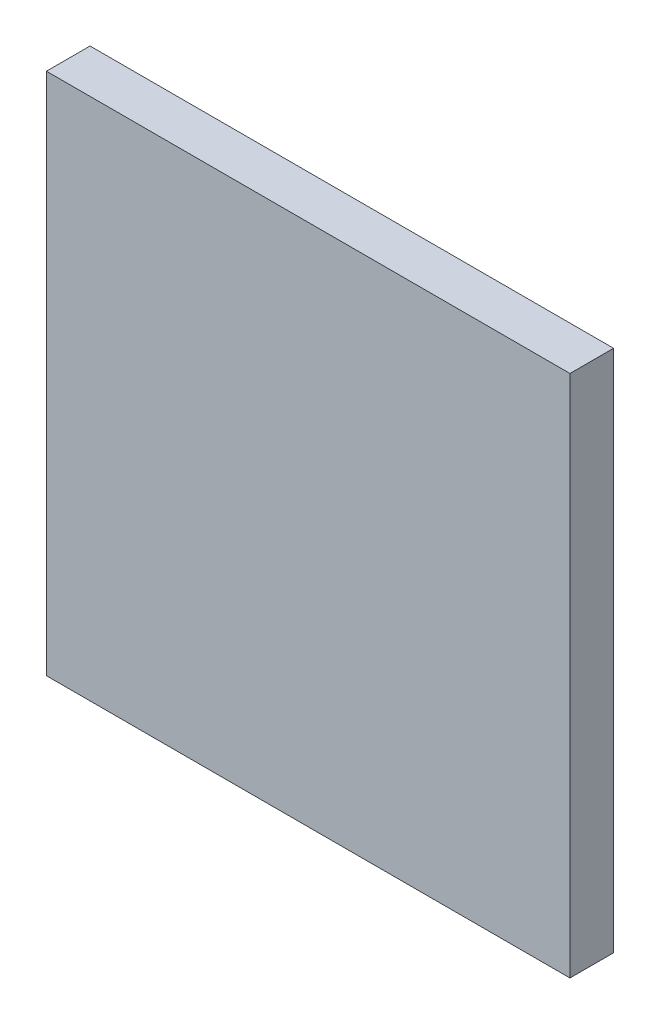
ISO-10303-21;
HEADER;
FILE_DESCRIPTION(('STEP AP214'),'2;1');
FILE_NAME('part.step','',(''),(''),'','','');
FILE_SCHEMA(('AUTOMOTIVE_DESIGN { 1 0 10303 214 1 1 1 1 }'));
ENDSEC;
DATA;
#1=APPLICATION_CONTEXT('core data for automotive mechanical design processes');
#2=APPLICATION_PROTOCOL_DEFINITION('international standard','automotive_design',2000,#1);
#3=PRODUCT_CONTEXT('',#1,'mechanical');
#4=PRODUCT('Part','Part','',(#3));
#5=PRODUCT_RELATED_PRODUCT_CATEGORY('part','',(#4));
#6=PRODUCT_DEFINITION_FORMATION('','',#4);
#7=PRODUCT_DEFINITION_CONTEXT('part definition',#1,'design');
#8=PRODUCT_DEFINITION('design','',#6,#7);
#9=PRODUCT_DEFINITION_SHAPE('','',#8);
#10=(LENGTH_UNIT() NAMED_UNIT(*) SI_UNIT(.MILLI.,.METRE.));
#11=(NAMED_UNIT(*) PLANE_ANGLE_UNIT() SI_UNIT($,.RADIAN.));
#12=(NAMED_UNIT(*) SI_UNIT($,.STERADIAN.) SOLID_ANGLE_UNIT());
#13=UNCERTAINTY_MEASURE_WITH_UNIT(LENGTH_MEASURE(1.E-05),#10,'distance_accuracy_value','');
#14=(GEOMETRIC_REPRESENTATION_CONTEXT(3) GLOBAL_UNCERTAINTY_ASSIGNED_CONTEXT((#13)) GLOBAL_UNIT_ASSIGNED_CONTEXT((#10,
#11,#12)) REPRESENTATION_CONTEXT('',''));
#15=CARTESIAN_POINT('',(0.,0.,0.));
#16=DIRECTION('',(0.,0.,1.));
#17=DIRECTION('',(1.,0.,0.));
#18=AXIS2_PLACEMENT_3D('',#15,#16,#17);
#19=CARTESIAN_POINT('',(0.,0.,1.5));
#20=DIRECTION('',(1.,0.,0.));
#21=DIRECTION('',(0.,0.,-1.));
#22=AXIS2_PLACEMENT_3D('',#19,#20,#21);
#23=PLANE('',#22);
#24=DIRECTION('',(0.,-1.,0.));
#25=VECTOR('',#24,1.);
#26=CARTESIAN_POINT('',(0.,0.,0.));
#27=LINE('',#26,#25);
#28=CARTESIAN_POINT('',(0.,18.,0.));
#29=VERTEX_POINT('',#28);
#30=CARTESIAN_POINT('',(0.,0.,0.));
#31=VERTEX_POINT('',#30);
#32=EDGE_CURVE('E86',#29,#31,#27,.T.);
#33=ORIENTED_EDGE('',*,*,#32,.T.);
#34=DIRECTION('',(0.,0.,-1.));
#35=VECTOR('',#34,1.);
#36=CARTESIAN_POINT('',(0.,0.,1.5));
#37=LINE('',#36,#35);
#38=CARTESIAN_POINT('',(0.,0.,1.5));
#39=VERTEX_POINT('',#38);
#40=EDGE_CURVE('E11',#39,#31,#37,.T.);
#41=ORIENTED_EDGE('',*,*,#40,.F.);
#42=DIRECTION('',(0.,-1.,0.));
#43=VECTOR('',#42,1.);
#44=CARTESIAN_POINT('',(0.,0.,1.5));
#45=LINE('',#44,#43);
#46=CARTESIAN_POINT('',(0.,18.,1.5));
#47=VERTEX_POINT('',#46);
#48=EDGE_CURVE('E68',#47,#39,#45,.T.);
#49=ORIENTED_EDGE('',*,*,#48,.F.);
#50=DIRECTION('',(0.,0.,-1.));
#51=VECTOR('',#50,1.);
#52=CARTESIAN_POINT('',(0.,18.,1.5));
#53=LINE('',#52,#51);
#54=EDGE_CURVE('E82',#47,#29,#53,.T.);
#55=ORIENTED_EDGE('',*,*,#54,.T.);
#56=EDGE_LOOP('',(#33,#41,#49,#55));
#57=FACE_BOUND('',#56,.T.);
#58=ADVANCED_FACE('F16',(#57),#23,.F.);
#59=CARTESIAN_POINT('',(0.,0.,1.5));
#60=DIRECTION('',(0.,1.,0.));
#61=DIRECTION('',(0.,0.,1.));
#62=AXIS2_PLACEMENT_3D('',#59,#60,#61);
#63=PLANE('',#62);
#64=DIRECTION('',(1.,0.,0.));
#65=VECTOR('',#64,1.);
#66=CARTESIAN_POINT('',(0.,0.,0.));
#67=LINE('',#66,#65);
#68=CARTESIAN_POINT('',(18.,0.,0.));
#69=VERTEX_POINT('',#68);
#70=EDGE_CURVE('E73',#31,#69,#67,.T.);
#71=ORIENTED_EDGE('',*,*,#70,.T.);
#72=DIRECTION('',(0.,0.,-1.));
#73=VECTOR('',#72,1.);
#74=CARTESIAN_POINT('',(18.,0.,1.5));
#75=LINE('',#74,#73);
#76=CARTESIAN_POINT('',(18.,0.,1.5));
#77=VERTEX_POINT('',#76);
#78=EDGE_CURVE('E25',#77,#69,#75,.T.);
#79=ORIENTED_EDGE('',*,*,#78,.F.);
#80=DIRECTION('',(1.,0.,0.));
#81=VECTOR('',#80,1.);
#82=CARTESIAN_POINT('',(0.,0.,1.5));
#83=LINE('',#82,#81);
#84=EDGE_CURVE('E63',#39,#77,#83,.T.);
#85=ORIENTED_EDGE('',*,*,#84,.F.);
#86=ORIENTED_EDGE('',*,*,#40,.T.);
#87=EDGE_LOOP('',(#71,#79,#85,#86));
#88=FACE_BOUND('',#87,.T.);
#89=ADVANCED_FACE('F72',(#88),#63,.F.);
#90=CARTESIAN_POINT('',(18.,0.,1.5));
#91=DIRECTION('',(-1.,0.,0.));
#92=DIRECTION('',(0.,0.,1.));
#93=AXIS2_PLACEMENT_3D('',#90,#91,#92);
#94=PLANE('',#93);
#95=DIRECTION('',(0.,1.,0.));
#96=VECTOR('',#95,1.);
#97=CARTESIAN_POINT('',(18.,0.,0.));
#98=LINE('',#97,#96);
#99=CARTESIAN_POINT('',(18.,18.,0.));
#100=VERTEX_POINT('',#99);
#101=EDGE_CURVE('E50',#69,#100,#98,.T.);
#102=ORIENTED_EDGE('',*,*,#101,.T.);
#103=DIRECTION('',(0.,0.,-1.));
#104=VECTOR('',#103,1.);
#105=CARTESIAN_POINT('',(18.,18.,1.5));
#106=LINE('',#105,#104);
#107=CARTESIAN_POINT('',(18.,18.,1.5));
#108=VERTEX_POINT('',#107);
#109=EDGE_CURVE('E75',#108,#100,#106,.T.);
#110=ORIENTED_EDGE('',*,*,#109,.F.);
#111=DIRECTION('',(0.,1.,0.));
#112=VECTOR('',#111,1.);
#113=CARTESIAN_POINT('',(18.,0.,1.5));
#114=LINE('',#113,#112);
#115=EDGE_CURVE('E66',#77,#108,#114,.T.);
#116=ORIENTED_EDGE('',*,*,#115,.F.);
#117=ORIENTED_EDGE('',*,*,#78,.T.);
#118=EDGE_LOOP('',(#102,#110,#116,#117));
#119=FACE_BOUND('',#118,.T.);
#120=ADVANCED_FACE('F76',(#119),#94,.F.);
#121=CARTESIAN_POINT('',(0.,18.,1.5));
#122=DIRECTION('',(0.,-1.,0.));
#123=DIRECTION('',(0.,0.,-1.));
#124=AXIS2_PLACEMENT_3D('',#121,#122,#123);
#125=PLANE('',#124);
#126=DIRECTION('',(-1.,0.,0.));
#127=VECTOR('',#126,1.);
#128=CARTESIAN_POINT('',(0.,18.,0.));
#129=LINE('',#128,#127);
#130=EDGE_CURVE('E56',#100,#29,#129,.T.);
#131=ORIENTED_EDGE('',*,*,#130,.T.);
#132=ORIENTED_EDGE('',*,*,#54,.F.);
#133=DIRECTION('',(-1.,0.,0.));
#134=VECTOR('',#133,1.);
#135=CARTESIAN_POINT('',(0.,18.,1.5));
#136=LINE('',#135,#134);
#137=EDGE_CURVE('E33',#108,#47,#136,.T.);
#138=ORIENTED_EDGE('',*,*,#137,.F.);
#139=ORIENTED_EDGE('',*,*,#109,.T.);
#140=EDGE_LOOP('',(#131,#132,#138,#139));
#141=FACE_BOUND('',#140,.T.);
#142=ADVANCED_FACE('F100',(#141),#125,.F.);
#143=CARTESIAN_POINT('',(0.,0.,1.5));
#144=DIRECTION('',(0.,0.,-1.));
#145=DIRECTION('',(-1.,0.,0.));
#146=AXIS2_PLACEMENT_3D('',#143,#144,#145);
#147=PLANE('',#146);
#148=ORIENTED_EDGE('',*,*,#48,.T.);
#149=ORIENTED_EDGE('',*,*,#84,.T.);
#150=ORIENTED_EDGE('',*,*,#115,.T.);
#151=ORIENTED_EDGE('',*,*,#137,.T.);
#152=EDGE_LOOP('',(#148,#149,#150,#151));
#153=FACE_BOUND('',#152,.T.);
#154=ADVANCED_FACE('F64',(#153),#147,.F.);
#155=CARTESIAN_POINT('',(0.,0.,0.));
#156=DIRECTION('',(0.,0.,-1.));
#157=DIRECTION('',(-1.,0.,0.));
#158=AXIS2_PLACEMENT_3D('',#155,#156,#157);
#159=PLANE('',#158);
#160=ORIENTED_EDGE('',*,*,#32,.F.);
#161=ORIENTED_EDGE('',*,*,#130,.F.);
#162=ORIENTED_EDGE('',*,*,#101,.F.);
#163=ORIENTED_EDGE('',*,*,#70,.F.);
#164=EDGE_LOOP('',(#160,#161,#162,#163));
#165=FACE_BOUND('',#164,.T.);
#166=ADVANCED_FACE('F103',(#165),#159,.T.);
#167=CLOSED_SHELL('',(#58,#89,#120,#142,#154,#166));
#168=MANIFOLD_SOLID_BREP('B1',#167);
#169=ADVANCED_BREP_SHAPE_REPRESENTATION('',(#18,#168),#14);
#170=SHAPE_DEFINITION_REPRESENTATION(#9,#169);
ENDSEC;
END-ISO-10303-21;
